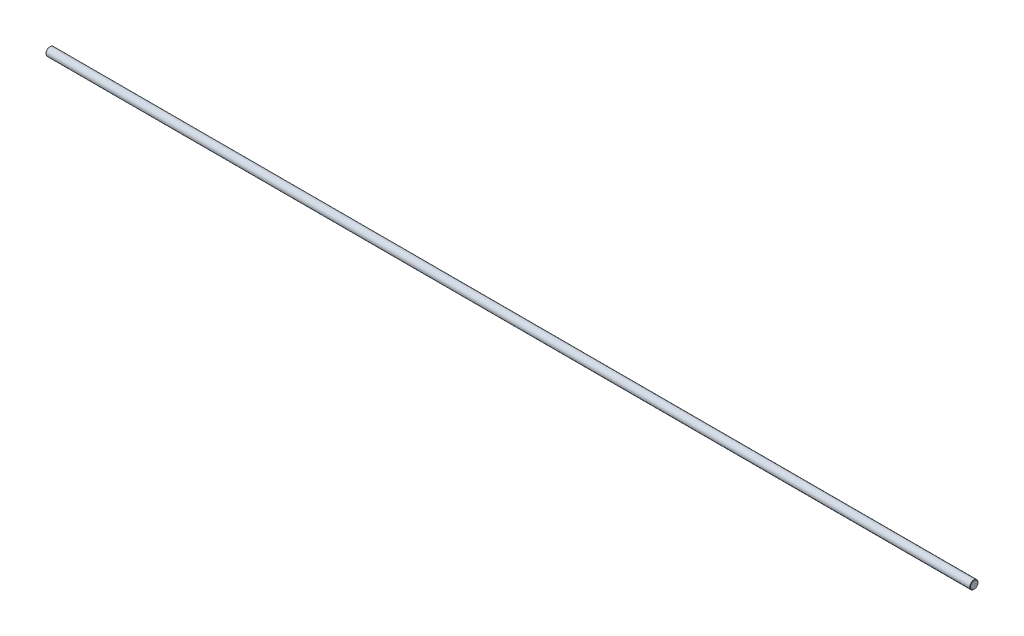
ISO-10303-21;
HEADER;
FILE_DESCRIPTION(('STEP AP214'),'2;1');
FILE_NAME('part.step','',(''),(''),'','','');
FILE_SCHEMA(('AUTOMOTIVE_DESIGN { 1 0 10303 214 1 1 1 1 }'));
ENDSEC;
DATA;
#1=APPLICATION_CONTEXT('core data for automotive mechanical design processes');
#2=APPLICATION_PROTOCOL_DEFINITION('international standard','automotive_design',2000,#1);
#3=PRODUCT_CONTEXT('',#1,'mechanical');
#4=PRODUCT('Part','Part','',(#3));
#5=PRODUCT_RELATED_PRODUCT_CATEGORY('part','',(#4));
#6=PRODUCT_DEFINITION_FORMATION('','',#4);
#7=PRODUCT_DEFINITION_CONTEXT('part definition',#1,'design');
#8=PRODUCT_DEFINITION('design','',#6,#7);
#9=PRODUCT_DEFINITION_SHAPE('','',#8);
#10=(LENGTH_UNIT() NAMED_UNIT(*) SI_UNIT(.MILLI.,.METRE.));
#11=(NAMED_UNIT(*) PLANE_ANGLE_UNIT() SI_UNIT($,.RADIAN.));
#12=(NAMED_UNIT(*) SI_UNIT($,.STERADIAN.) SOLID_ANGLE_UNIT());
#13=UNCERTAINTY_MEASURE_WITH_UNIT(LENGTH_MEASURE(1.E-05),#10,'distance_accuracy_value','');
#14=(GEOMETRIC_REPRESENTATION_CONTEXT(3) GLOBAL_UNCERTAINTY_ASSIGNED_CONTEXT((#13)) GLOBAL_UNIT_ASSIGNED_CONTEXT((#10,
#11,#12)) REPRESENTATION_CONTEXT('',''));
#15=CARTESIAN_POINT('',(0.,0.,0.));
#16=DIRECTION('',(0.,0.,1.));
#17=DIRECTION('',(1.,0.,0.));
#18=AXIS2_PLACEMENT_3D('',#15,#16,#17);
#19=CARTESIAN_POINT('',(1340.,0.,0.));
#20=DIRECTION('',(-1.,0.,0.));
#21=DIRECTION('',(0.,0.,1.));
#22=AXIS2_PLACEMENT_3D('',#19,#20,#21);
#23=CYLINDRICAL_SURFACE('',#22,6.);
#24=CARTESIAN_POINT('',(0.500000000000167,0.,0.));
#25=DIRECTION('',(1.,0.,0.));
#26=DIRECTION('',(0.,0.,-1.));
#27=AXIS2_PLACEMENT_3D('',#24,#25,#26);
#28=CIRCLE('',#27,6.);
#29=CARTESIAN_POINT('',(0.500000000000167,0.,-6.));
#30=VERTEX_POINT('',#29);
#31=EDGE_CURVE('E59',#30,#30,#28,.T.);
#32=ORIENTED_EDGE('',*,*,#31,.T.);
#33=EDGE_LOOP('',(#32));
#34=FACE_BOUND('',#33,.T.);
#35=CARTESIAN_POINT('',(1339.5,0.,0.));
#36=DIRECTION('',(1.,0.,0.));
#37=DIRECTION('',(0.,0.,-1.));
#38=AXIS2_PLACEMENT_3D('',#35,#36,#37);
#39=CIRCLE('',#38,6.);
#40=CARTESIAN_POINT('',(1339.5,0.,-6.));
#41=VERTEX_POINT('',#40);
#42=EDGE_CURVE('E64',#41,#41,#39,.F.);
#43=ORIENTED_EDGE('',*,*,#42,.T.);
#44=EDGE_LOOP('',(#43));
#45=FACE_BOUND('',#44,.T.);
#46=ADVANCED_FACE('F45',(#34,#45),#23,.T.);
#47=CARTESIAN_POINT('',(1340.,0.,0.));
#48=DIRECTION('',(1.,0.,0.));
#49=DIRECTION('',(0.,0.,-1.));
#50=AXIS2_PLACEMENT_3D('',#47,#48,#49);
#51=PLANE('',#50);
#52=CARTESIAN_POINT('',(1340.,0.,0.));
#53=DIRECTION('',(1.,0.,0.));
#54=DIRECTION('',(0.,0.,-1.));
#55=AXIS2_PLACEMENT_3D('',#52,#53,#54);
#56=CIRCLE('',#55,5.50000000000028);
#57=CARTESIAN_POINT('',(1340.,0.,-5.50000000000028));
#58=VERTEX_POINT('',#57);
#59=EDGE_CURVE('E10',#58,#58,#56,.T.);
#60=ORIENTED_EDGE('',*,*,#59,.T.);
#61=EDGE_LOOP('',(#60));
#62=FACE_BOUND('',#61,.T.);
#63=ADVANCED_FACE('F81',(#62),#51,.T.);
#64=CARTESIAN_POINT('',(0.,0.,0.));
#65=DIRECTION('',(1.,0.,0.));
#66=DIRECTION('',(0.,0.,-1.));
#67=AXIS2_PLACEMENT_3D('',#64,#65,#66);
#68=PLANE('',#67);
#69=CARTESIAN_POINT('',(0.,0.,0.));
#70=DIRECTION('',(1.,0.,0.));
#71=DIRECTION('',(0.,0.,-1.));
#72=AXIS2_PLACEMENT_3D('',#69,#70,#71);
#73=CIRCLE('',#72,5.49999999999973);
#74=CARTESIAN_POINT('',(0.,0.,-5.49999999999973));
#75=VERTEX_POINT('',#74);
#76=EDGE_CURVE('E54',#75,#75,#73,.F.);
#77=ORIENTED_EDGE('',*,*,#76,.T.);
#78=EDGE_LOOP('',(#77));
#79=FACE_BOUND('',#78,.T.);
#80=ADVANCED_FACE('F78',(#79),#68,.F.);
#81=CARTESIAN_POINT('',(0.500000000000167,0.,0.));
#82=DIRECTION('',(1.,0.,0.));
#83=DIRECTION('',(0.,0.,-1.));
#84=AXIS2_PLACEMENT_3D('',#81,#82,#83);
#85=CONICAL_SURFACE('',#84,6.,0.785398163397554);
#86=ORIENTED_EDGE('',*,*,#76,.F.);
#87=EDGE_LOOP('',(#86));
#88=FACE_BOUND('',#87,.T.);
#89=ORIENTED_EDGE('',*,*,#31,.F.);
#90=EDGE_LOOP('',(#89));
#91=FACE_BOUND('',#90,.T.);
#92=ADVANCED_FACE('F74',(#88,#91),#85,.T.);
#93=CARTESIAN_POINT('',(1340.,0.,0.));
#94=DIRECTION('',(-1.,0.,0.));
#95=DIRECTION('',(0.,0.,1.));
#96=AXIS2_PLACEMENT_3D('',#93,#94,#95);
#97=CONICAL_SURFACE('',#96,5.50000000000028,0.785398163397444);
#98=ORIENTED_EDGE('',*,*,#42,.F.);
#99=EDGE_LOOP('',(#98));
#100=FACE_BOUND('',#99,.T.);
#101=ORIENTED_EDGE('',*,*,#59,.F.);
#102=EDGE_LOOP('',(#101));
#103=FACE_BOUND('',#102,.T.);
#104=ADVANCED_FACE('F48',(#100,#103),#97,.T.);
#105=CLOSED_SHELL('',(#46,#63,#80,#92,#104));
#106=MANIFOLD_SOLID_BREP('B2',#105);
#107=ADVANCED_BREP_SHAPE_REPRESENTATION('',(#18,#106),#14);
#108=SHAPE_DEFINITION_REPRESENTATION(#9,#107);
ENDSEC;
END-ISO-10303-21;
